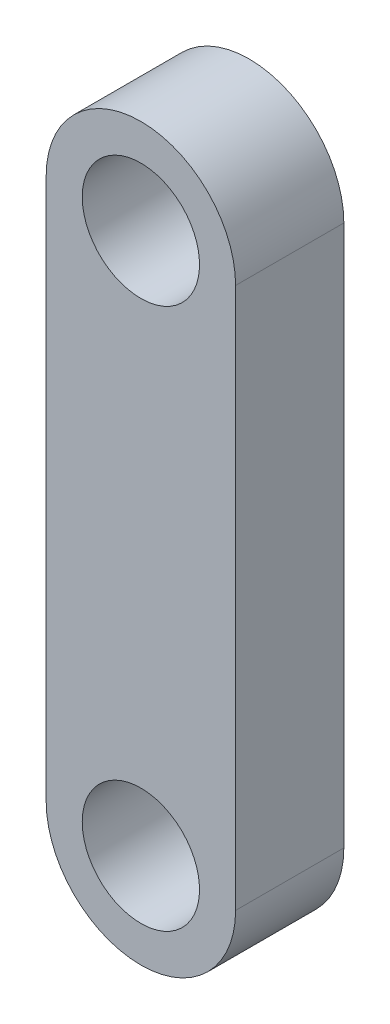
ISO-10303-21;
HEADER;
FILE_DESCRIPTION(('STEP AP214'),'2;1');
FILE_NAME('part.step','',(''),(''),'','','');
FILE_SCHEMA(('AUTOMOTIVE_DESIGN { 1 0 10303 214 1 1 1 1 }'));
ENDSEC;
DATA;
#1=APPLICATION_CONTEXT('core data for automotive mechanical design processes');
#2=APPLICATION_PROTOCOL_DEFINITION('international standard','automotive_design',2000,#1);
#3=PRODUCT_CONTEXT('',#1,'mechanical');
#4=PRODUCT('Part','Part','',(#3));
#5=PRODUCT_RELATED_PRODUCT_CATEGORY('part','',(#4));
#6=PRODUCT_DEFINITION_FORMATION('','',#4);
#7=PRODUCT_DEFINITION_CONTEXT('part definition',#1,'design');
#8=PRODUCT_DEFINITION('design','',#6,#7);
#9=PRODUCT_DEFINITION_SHAPE('','',#8);
#10=(LENGTH_UNIT() NAMED_UNIT(*) SI_UNIT(.MILLI.,.METRE.));
#11=(NAMED_UNIT(*) PLANE_ANGLE_UNIT() SI_UNIT($,.RADIAN.));
#12=(NAMED_UNIT(*) SI_UNIT($,.STERADIAN.) SOLID_ANGLE_UNIT());
#13=UNCERTAINTY_MEASURE_WITH_UNIT(LENGTH_MEASURE(1.E-05),#10,'distance_accuracy_value','');
#14=(GEOMETRIC_REPRESENTATION_CONTEXT(3) GLOBAL_UNCERTAINTY_ASSIGNED_CONTEXT((#13)) GLOBAL_UNIT_ASSIGNED_CONTEXT((#10,
#11,#12)) REPRESENTATION_CONTEXT('',''));
#15=CARTESIAN_POINT('',(0.,0.,0.));
#16=DIRECTION('',(0.,0.,1.));
#17=DIRECTION('',(1.,0.,0.));
#18=AXIS2_PLACEMENT_3D('',#15,#16,#17);
#19=CARTESIAN_POINT('',(0.,0.,6.));
#20=DIRECTION('',(0.,0.,-1.));
#21=DIRECTION('',(-1.,0.,0.));
#22=AXIS2_PLACEMENT_3D('',#19,#20,#21);
#23=CYLINDRICAL_SURFACE('',#22,5.25);
#24=CARTESIAN_POINT('',(0.,0.,0.));
#25=DIRECTION('',(0.,0.,-1.));
#26=DIRECTION('',(-1.,0.,0.));
#27=AXIS2_PLACEMENT_3D('',#24,#25,#26);
#28=CIRCLE('',#27,5.25);
#29=CARTESIAN_POINT('',(-5.25,0.,0.));
#30=VERTEX_POINT('',#29);
#31=CARTESIAN_POINT('',(5.25,0.,0.));
#32=VERTEX_POINT('',#31);
#33=EDGE_CURVE('E99',#30,#32,#28,.T.);
#34=ORIENTED_EDGE('',*,*,#33,.F.);
#35=DIRECTION('',(0.,0.,-1.));
#36=VECTOR('',#35,1.);
#37=CARTESIAN_POINT('',(-5.25,0.,6.));
#38=LINE('',#37,#36);
#39=CARTESIAN_POINT('',(-5.25,0.,6.));
#40=VERTEX_POINT('',#39);
#41=EDGE_CURVE('E11',#40,#30,#38,.T.);
#42=ORIENTED_EDGE('',*,*,#41,.F.);
#43=CARTESIAN_POINT('',(0.,0.,6.));
#44=DIRECTION('',(0.,0.,-1.));
#45=DIRECTION('',(-1.,0.,0.));
#46=AXIS2_PLACEMENT_3D('',#43,#44,#45);
#47=CIRCLE('',#46,5.25);
#48=CARTESIAN_POINT('',(5.25,0.,6.));
#49=VERTEX_POINT('',#48);
#50=EDGE_CURVE('E93',#40,#49,#47,.T.);
#51=ORIENTED_EDGE('',*,*,#50,.T.);
#52=DIRECTION('',(0.,0.,-1.));
#53=VECTOR('',#52,1.);
#54=CARTESIAN_POINT('',(5.25,0.,6.));
#55=LINE('',#54,#53);
#56=EDGE_CURVE('E36',#49,#32,#55,.T.);
#57=ORIENTED_EDGE('',*,*,#56,.T.);
#58=EDGE_LOOP('',(#34,#42,#51,#57));
#59=FACE_BOUND('',#58,.T.);
#60=ADVANCED_FACE('F33',(#59),#23,.T.);
#61=CARTESIAN_POINT('',(-5.25,0.,6.));
#62=DIRECTION('',(1.,0.,0.));
#63=DIRECTION('',(0.,0.,-1.));
#64=AXIS2_PLACEMENT_3D('',#61,#62,#63);
#65=PLANE('',#64);
#66=DIRECTION('',(0.,-1.,0.));
#67=VECTOR('',#66,1.);
#68=CARTESIAN_POINT('',(-5.25,0.,0.));
#69=LINE('',#68,#67);
#70=CARTESIAN_POINT('',(-5.25,-30.,0.));
#71=VERTEX_POINT('',#70);
#72=EDGE_CURVE('E66',#30,#71,#69,.T.);
#73=ORIENTED_EDGE('',*,*,#72,.T.);
#74=DIRECTION('',(0.,0.,-1.));
#75=VECTOR('',#74,1.);
#76=CARTESIAN_POINT('',(-5.25,-30.,6.));
#77=LINE('',#76,#75);
#78=CARTESIAN_POINT('',(-5.25,-30.,6.));
#79=VERTEX_POINT('',#78);
#80=EDGE_CURVE('E42',#79,#71,#77,.T.);
#81=ORIENTED_EDGE('',*,*,#80,.F.);
#82=DIRECTION('',(0.,-1.,0.));
#83=VECTOR('',#82,1.);
#84=CARTESIAN_POINT('',(-5.25,0.,6.));
#85=LINE('',#84,#83);
#86=EDGE_CURVE('E83',#40,#79,#85,.T.);
#87=ORIENTED_EDGE('',*,*,#86,.F.);
#88=ORIENTED_EDGE('',*,*,#41,.T.);
#89=EDGE_LOOP('',(#73,#81,#87,#88));
#90=FACE_BOUND('',#89,.T.);
#91=ADVANCED_FACE('F110',(#90),#65,.F.);
#92=CARTESIAN_POINT('',(0.,-30.,6.));
#93=DIRECTION('',(0.,0.,-1.));
#94=DIRECTION('',(-1.,0.,0.));
#95=AXIS2_PLACEMENT_3D('',#92,#93,#94);
#96=CYLINDRICAL_SURFACE('',#95,5.25);
#97=CARTESIAN_POINT('',(0.,-30.,0.));
#98=DIRECTION('',(0.,0.,1.));
#99=DIRECTION('',(1.,0.,0.));
#100=AXIS2_PLACEMENT_3D('',#97,#98,#99);
#101=CIRCLE('',#100,5.25);
#102=CARTESIAN_POINT('',(5.25,-30.,0.));
#103=VERTEX_POINT('',#102);
#104=EDGE_CURVE('E90',#71,#103,#101,.T.);
#105=ORIENTED_EDGE('',*,*,#104,.T.);
#106=DIRECTION('',(0.,0.,-1.));
#107=VECTOR('',#106,1.);
#108=CARTESIAN_POINT('',(5.25,-30.,6.));
#109=LINE('',#108,#107);
#110=CARTESIAN_POINT('',(5.25,-30.,6.));
#111=VERTEX_POINT('',#110);
#112=EDGE_CURVE('E87',#111,#103,#109,.T.);
#113=ORIENTED_EDGE('',*,*,#112,.F.);
#114=CARTESIAN_POINT('',(0.,-30.,6.));
#115=DIRECTION('',(0.,0.,1.));
#116=DIRECTION('',(1.,0.,0.));
#117=AXIS2_PLACEMENT_3D('',#114,#115,#116);
#118=CIRCLE('',#117,5.25);
#119=EDGE_CURVE('E78',#79,#111,#118,.T.);
#120=ORIENTED_EDGE('',*,*,#119,.F.);
#121=ORIENTED_EDGE('',*,*,#80,.T.);
#122=EDGE_LOOP('',(#105,#113,#120,#121));
#123=FACE_BOUND('',#122,.T.);
#124=ADVANCED_FACE('F88',(#123),#96,.T.);
#125=CARTESIAN_POINT('',(5.25,0.,6.));
#126=DIRECTION('',(1.,0.,0.));
#127=DIRECTION('',(0.,0.,-1.));
#128=AXIS2_PLACEMENT_3D('',#125,#126,#127);
#129=PLANE('',#128);
#130=DIRECTION('',(0.,-1.,0.));
#131=VECTOR('',#130,1.);
#132=CARTESIAN_POINT('',(5.25,0.,0.));
#133=LINE('',#132,#131);
#134=EDGE_CURVE('E102',#32,#103,#133,.T.);
#135=ORIENTED_EDGE('',*,*,#134,.F.);
#136=ORIENTED_EDGE('',*,*,#56,.F.);
#137=DIRECTION('',(0.,-1.,0.));
#138=VECTOR('',#137,1.);
#139=CARTESIAN_POINT('',(5.25,0.,6.));
#140=LINE('',#139,#138);
#141=EDGE_CURVE('E82',#49,#111,#140,.T.);
#142=ORIENTED_EDGE('',*,*,#141,.T.);
#143=ORIENTED_EDGE('',*,*,#112,.T.);
#144=EDGE_LOOP('',(#135,#136,#142,#143));
#145=FACE_BOUND('',#144,.T.);
#146=ADVANCED_FACE('F92',(#145),#129,.T.);
#147=CARTESIAN_POINT('',(0.,0.,6.));
#148=DIRECTION('',(0.,0.,-1.));
#149=DIRECTION('',(-1.,0.,0.));
#150=AXIS2_PLACEMENT_3D('',#147,#148,#149);
#151=PLANE('',#150);
#152=CARTESIAN_POINT('',(0.,-30.,6.));
#153=DIRECTION('',(0.,0.,-1.));
#154=DIRECTION('',(-1.,0.,0.));
#155=AXIS2_PLACEMENT_3D('',#152,#153,#154);
#156=CIRCLE('',#155,3.25);
#157=CARTESIAN_POINT('',(-3.25,-30.,6.));
#158=VERTEX_POINT('',#157);
#159=EDGE_CURVE('E103',#158,#158,#156,.F.);
#160=ORIENTED_EDGE('',*,*,#159,.F.);
#161=EDGE_LOOP('',(#160));
#162=FACE_BOUND('',#161,.T.);
#163=CARTESIAN_POINT('',(0.,0.,6.));
#164=DIRECTION('',(0.,0.,-1.));
#165=DIRECTION('',(-1.,0.,0.));
#166=AXIS2_PLACEMENT_3D('',#163,#164,#165);
#167=CIRCLE('',#166,3.25);
#168=CARTESIAN_POINT('',(-3.25,0.,6.));
#169=VERTEX_POINT('',#168);
#170=EDGE_CURVE('E147',#169,#169,#167,.F.);
#171=ORIENTED_EDGE('',*,*,#170,.F.);
#172=EDGE_LOOP('',(#171));
#173=FACE_BOUND('',#172,.T.);
#174=ORIENTED_EDGE('',*,*,#50,.F.);
#175=ORIENTED_EDGE('',*,*,#86,.T.);
#176=ORIENTED_EDGE('',*,*,#119,.T.);
#177=ORIENTED_EDGE('',*,*,#141,.F.);
#178=EDGE_LOOP('',(#174,#175,#176,#177));
#179=FACE_BOUND('',#178,.T.);
#180=ADVANCED_FACE('F81',(#162,#173,#179),#151,.F.);
#181=CARTESIAN_POINT('',(0.,0.,0.));
#182=DIRECTION('',(0.,0.,-1.));
#183=DIRECTION('',(-1.,0.,0.));
#184=AXIS2_PLACEMENT_3D('',#181,#182,#183);
#185=PLANE('',#184);
#186=CARTESIAN_POINT('',(0.,-30.,0.));
#187=DIRECTION('',(0.,0.,1.));
#188=DIRECTION('',(1.,0.,0.));
#189=AXIS2_PLACEMENT_3D('',#186,#187,#188);
#190=CIRCLE('',#189,3.25);
#191=CARTESIAN_POINT('',(3.25,-30.,0.));
#192=VERTEX_POINT('',#191);
#193=EDGE_CURVE('E145',#192,#192,#190,.T.);
#194=ORIENTED_EDGE('',*,*,#193,.T.);
#195=EDGE_LOOP('',(#194));
#196=FACE_BOUND('',#195,.T.);
#197=CARTESIAN_POINT('',(0.,0.,0.));
#198=DIRECTION('',(0.,0.,1.));
#199=DIRECTION('',(1.,0.,0.));
#200=AXIS2_PLACEMENT_3D('',#197,#198,#199);
#201=CIRCLE('',#200,3.25);
#202=CARTESIAN_POINT('',(3.25,0.,0.));
#203=VERTEX_POINT('',#202);
#204=EDGE_CURVE('E151',#203,#203,#201,.T.);
#205=ORIENTED_EDGE('',*,*,#204,.T.);
#206=EDGE_LOOP('',(#205));
#207=FACE_BOUND('',#206,.T.);
#208=ORIENTED_EDGE('',*,*,#33,.T.);
#209=ORIENTED_EDGE('',*,*,#134,.T.);
#210=ORIENTED_EDGE('',*,*,#104,.F.);
#211=ORIENTED_EDGE('',*,*,#72,.F.);
#212=EDGE_LOOP('',(#208,#209,#210,#211));
#213=FACE_BOUND('',#212,.T.);
#214=ADVANCED_FACE('F108',(#196,#207,#213),#185,.T.);
#215=CARTESIAN_POINT('',(0.,0.,16.));
#216=DIRECTION('',(0.,0.,-1.));
#217=DIRECTION('',(-1.,0.,0.));
#218=AXIS2_PLACEMENT_3D('',#215,#216,#217);
#219=CYLINDRICAL_SURFACE('',#218,3.25);
#220=ORIENTED_EDGE('',*,*,#204,.F.);
#221=EDGE_LOOP('',(#220));
#222=FACE_BOUND('',#221,.T.);
#223=ORIENTED_EDGE('',*,*,#170,.T.);
#224=EDGE_LOOP('',(#223));
#225=FACE_BOUND('',#224,.T.);
#226=ADVANCED_FACE('F129',(#222,#225),#219,.F.);
#227=CARTESIAN_POINT('',(0.,-30.,16.));
#228=DIRECTION('',(0.,0.,-1.));
#229=DIRECTION('',(-1.,0.,0.));
#230=AXIS2_PLACEMENT_3D('',#227,#228,#229);
#231=CYLINDRICAL_SURFACE('',#230,3.25);
#232=ORIENTED_EDGE('',*,*,#193,.F.);
#233=EDGE_LOOP('',(#232));
#234=FACE_BOUND('',#233,.T.);
#235=ORIENTED_EDGE('',*,*,#159,.T.);
#236=EDGE_LOOP('',(#235));
#237=FACE_BOUND('',#236,.T.);
#238=ADVANCED_FACE('F136',(#234,#237),#231,.F.);
#239=CLOSED_SHELL('',(#60,#91,#124,#146,#180,#214,#226,#238));
#240=MANIFOLD_SOLID_BREP('B2',#239);
#241=ADVANCED_BREP_SHAPE_REPRESENTATION('',(#18,#240),#14);
#242=SHAPE_DEFINITION_REPRESENTATION(#9,#241);
ENDSEC;
END-ISO-10303-21;
